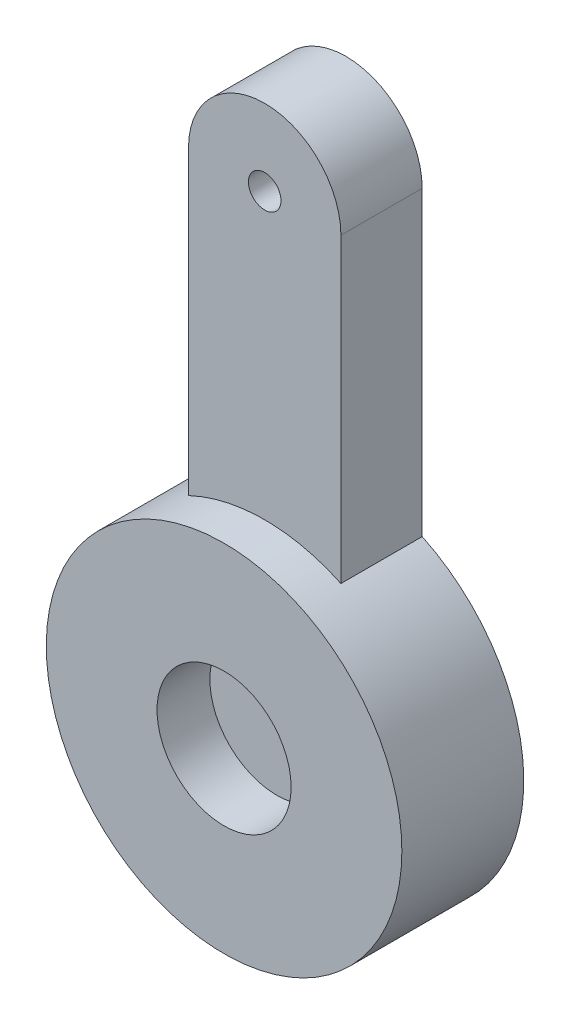
ISO-10303-21;
HEADER;
FILE_DESCRIPTION(('STEP AP214'),'2;1');
FILE_NAME('part.step','',(''),(''),'','','');
FILE_SCHEMA(('AUTOMOTIVE_DESIGN { 1 0 10303 214 1 1 1 1 }'));
ENDSEC;
DATA;
#1=APPLICATION_CONTEXT('core data for automotive mechanical design processes');
#2=APPLICATION_PROTOCOL_DEFINITION('international standard','automotive_design',2000,#1);
#3=PRODUCT_CONTEXT('',#1,'mechanical');
#4=PRODUCT('Part','Part','',(#3));
#5=PRODUCT_RELATED_PRODUCT_CATEGORY('part','',(#4));
#6=PRODUCT_DEFINITION_FORMATION('','',#4);
#7=PRODUCT_DEFINITION_CONTEXT('part definition',#1,'design');
#8=PRODUCT_DEFINITION('design','',#6,#7);
#9=PRODUCT_DEFINITION_SHAPE('','',#8);
#10=(LENGTH_UNIT() NAMED_UNIT(*) SI_UNIT(.MILLI.,.METRE.));
#11=(NAMED_UNIT(*) PLANE_ANGLE_UNIT() SI_UNIT($,.RADIAN.));
#12=(NAMED_UNIT(*) SI_UNIT($,.STERADIAN.) SOLID_ANGLE_UNIT());
#13=UNCERTAINTY_MEASURE_WITH_UNIT(LENGTH_MEASURE(1.E-05),#10,'distance_accuracy_value','');
#14=(GEOMETRIC_REPRESENTATION_CONTEXT(3) GLOBAL_UNCERTAINTY_ASSIGNED_CONTEXT((#13)) GLOBAL_UNIT_ASSIGNED_CONTEXT((#10,
#11,#12)) REPRESENTATION_CONTEXT('',''));
#15=CARTESIAN_POINT('',(0.,0.,0.));
#16=DIRECTION('',(0.,0.,1.));
#17=DIRECTION('',(1.,0.,0.));
#18=AXIS2_PLACEMENT_3D('',#15,#16,#17);
#19=CARTESIAN_POINT('',(3.05311331771918E-13,45.5,8.));
#20=DIRECTION('',(0.,0.,1.));
#21=DIRECTION('',(1.,0.,0.));
#22=AXIS2_PLACEMENT_3D('',#19,#20,#21);
#23=CYLINDRICAL_SURFACE('',#22,7.5);
#24=DIRECTION('',(0.,0.,-1.));
#25=VECTOR('',#24,1.);
#26=CARTESIAN_POINT('',(-7.4999999999997,45.5,8.));
#27=LINE('',#26,#25);
#28=CARTESIAN_POINT('',(-7.4999999999997,45.5,8.));
#29=VERTEX_POINT('',#28);
#30=CARTESIAN_POINT('',(-7.49999999999999,45.5,0.));
#31=VERTEX_POINT('',#30);
#32=EDGE_CURVE('E88',#29,#31,#27,.T.);
#33=ORIENTED_EDGE('',*,*,#32,.F.);
#34=CARTESIAN_POINT('',(3.05311331771918E-13,45.5,8.));
#35=DIRECTION('',(0.,0.,-1.));
#36=DIRECTION('',(-1.,0.,0.));
#37=AXIS2_PLACEMENT_3D('',#34,#35,#36);
#38=CIRCLE('',#37,7.5);
#39=CARTESIAN_POINT('',(7.50000000000001,45.5,8.));
#40=VERTEX_POINT('',#39);
#41=EDGE_CURVE('E63',#40,#29,#38,.F.);
#42=ORIENTED_EDGE('',*,*,#41,.F.);
#43=DIRECTION('',(0.,0.,-1.));
#44=VECTOR('',#43,1.);
#45=CARTESIAN_POINT('',(7.50000000000001,45.5,8.));
#46=LINE('',#45,#44);
#47=CARTESIAN_POINT('',(7.49999999999999,45.4999999999997,0.));
#48=VERTEX_POINT('',#47);
#49=EDGE_CURVE('E115',#48,#40,#46,.F.);
#50=ORIENTED_EDGE('',*,*,#49,.F.);
#51=CARTESIAN_POINT('',(0.,45.5,0.));
#52=DIRECTION('',(0.,0.,1.));
#53=DIRECTION('',(1.,0.,0.));
#54=AXIS2_PLACEMENT_3D('',#51,#52,#53);
#55=CIRCLE('',#54,7.5);
#56=EDGE_CURVE('E50',#31,#48,#55,.F.);
#57=ORIENTED_EDGE('',*,*,#56,.F.);
#58=EDGE_LOOP('',(#33,#42,#50,#57));
#59=FACE_BOUND('',#58,.T.);
#60=ADVANCED_FACE('F42',(#59),#23,.T.);
#61=CARTESIAN_POINT('',(0.,0.,12.));
#62=DIRECTION('',(0.,0.,-1.));
#63=DIRECTION('',(-1.,0.,0.));
#64=AXIS2_PLACEMENT_3D('',#61,#62,#63);
#65=CYLINDRICAL_SURFACE('',#64,17.5);
#66=CARTESIAN_POINT('',(0.,0.,12.));
#67=DIRECTION('',(0.,0.,1.));
#68=DIRECTION('',(1.,0.,0.));
#69=AXIS2_PLACEMENT_3D('',#66,#67,#68);
#70=CIRCLE('',#69,17.5);
#71=CARTESIAN_POINT('',(17.5,0.,12.));
#72=VERTEX_POINT('',#71);
#73=EDGE_CURVE('E99',#72,#72,#70,.T.);
#74=ORIENTED_EDGE('',*,*,#73,.F.);
#75=EDGE_LOOP('',(#74));
#76=FACE_BOUND('',#75,.T.);
#77=DIRECTION('',(0.,0.,-1.));
#78=VECTOR('',#77,1.);
#79=CARTESIAN_POINT('',(-7.5000000000003,15.8113883008416,12.));
#80=LINE('',#79,#78);
#81=CARTESIAN_POINT('',(-7.5000000000003,15.8113883008416,0.));
#82=VERTEX_POINT('',#81);
#83=CARTESIAN_POINT('',(-7.50000000000001,15.8113883008416,8.));
#84=VERTEX_POINT('',#83);
#85=EDGE_CURVE('E87',#82,#84,#80,.F.);
#86=ORIENTED_EDGE('',*,*,#85,.F.);
#87=CARTESIAN_POINT('',(0.,0.,0.));
#88=DIRECTION('',(0.,0.,1.));
#89=DIRECTION('',(1.,0.,0.));
#90=AXIS2_PLACEMENT_3D('',#87,#88,#89);
#91=CIRCLE('',#90,17.5);
#92=CARTESIAN_POINT('',(7.49999999999999,15.8113883008419,0.));
#93=VERTEX_POINT('',#92);
#94=EDGE_CURVE('E93',#82,#93,#91,.T.);
#95=ORIENTED_EDGE('',*,*,#94,.T.);
#96=DIRECTION('',(0.,0.,-1.));
#97=VECTOR('',#96,1.);
#98=CARTESIAN_POINT('',(7.50000000000001,15.8113883008419,12.));
#99=LINE('',#98,#97);
#100=CARTESIAN_POINT('',(7.50000000000001,15.8113883008419,8.));
#101=VERTEX_POINT('',#100);
#102=EDGE_CURVE('E105',#101,#93,#99,.T.);
#103=ORIENTED_EDGE('',*,*,#102,.F.);
#104=CARTESIAN_POINT('',(0.,0.,8.));
#105=DIRECTION('',(0.,0.,-1.));
#106=DIRECTION('',(-1.,0.,0.));
#107=AXIS2_PLACEMENT_3D('',#104,#105,#106);
#108=CIRCLE('',#107,17.5);
#109=EDGE_CURVE('E104',#84,#101,#108,.T.);
#110=ORIENTED_EDGE('',*,*,#109,.F.);
#111=EDGE_LOOP('',(#86,#95,#103,#110));
#112=FACE_BOUND('',#111,.T.);
#113=ADVANCED_FACE('F102',(#76,#112),#65,.T.);
#114=CARTESIAN_POINT('',(0.,0.,12.));
#115=DIRECTION('',(0.,0.,1.));
#116=DIRECTION('',(1.,0.,0.));
#117=AXIS2_PLACEMENT_3D('',#114,#115,#116);
#118=PLANE('',#117);
#119=CARTESIAN_POINT('',(0.,0.,12.));
#120=DIRECTION('',(0.,0.,1.));
#121=DIRECTION('',(1.,0.,0.));
#122=AXIS2_PLACEMENT_3D('',#119,#120,#121);
#123=CIRCLE('',#122,6.6);
#124=CARTESIAN_POINT('',(6.6,0.,12.));
#125=VERTEX_POINT('',#124);
#126=EDGE_CURVE('E124',#125,#125,#123,.T.);
#127=ORIENTED_EDGE('',*,*,#126,.F.);
#128=EDGE_LOOP('',(#127));
#129=FACE_BOUND('',#128,.T.);
#130=ORIENTED_EDGE('',*,*,#73,.T.);
#131=EDGE_LOOP('',(#130));
#132=FACE_BOUND('',#131,.T.);
#133=ADVANCED_FACE('F163',(#129,#132),#118,.T.);
#134=CARTESIAN_POINT('',(0.,0.,0.));
#135=DIRECTION('',(0.,0.,1.));
#136=DIRECTION('',(1.,0.,0.));
#137=AXIS2_PLACEMENT_3D('',#134,#135,#136);
#138=PLANE('',#137);
#139=CARTESIAN_POINT('',(0.,45.5,0.));
#140=DIRECTION('',(0.,0.,1.));
#141=DIRECTION('',(1.,0.,0.));
#142=AXIS2_PLACEMENT_3D('',#139,#140,#141);
#143=CIRCLE('',#142,5.);
#144=CARTESIAN_POINT('',(5.,45.5,0.));
#145=VERTEX_POINT('',#144);
#146=EDGE_CURVE('E11',#145,#145,#143,.F.);
#147=ORIENTED_EDGE('',*,*,#146,.F.);
#148=EDGE_LOOP('',(#147));
#149=FACE_BOUND('',#148,.T.);
#150=CARTESIAN_POINT('',(0.,0.,0.));
#151=DIRECTION('',(0.,0.,-1.));
#152=DIRECTION('',(-1.,0.,0.));
#153=AXIS2_PLACEMENT_3D('',#150,#151,#152);
#154=CIRCLE('',#153,6.6);
#155=CARTESIAN_POINT('',(-6.6,0.,0.));
#156=VERTEX_POINT('',#155);
#157=EDGE_CURVE('E130',#156,#156,#154,.T.);
#158=ORIENTED_EDGE('',*,*,#157,.F.);
#159=EDGE_LOOP('',(#158));
#160=FACE_BOUND('',#159,.T.);
#161=DIRECTION('',(0.,-1.,0.));
#162=VECTOR('',#161,1.);
#163=CARTESIAN_POINT('',(-7.49999999999999,38.,0.));
#164=LINE('',#163,#162);
#165=EDGE_CURVE('E82',#31,#82,#164,.T.);
#166=ORIENTED_EDGE('',*,*,#165,.F.);
#167=ORIENTED_EDGE('',*,*,#56,.T.);
#168=DIRECTION('',(0.,-1.,0.));
#169=VECTOR('',#168,1.);
#170=CARTESIAN_POINT('',(7.49999999999999,37.9999999999997,0.));
#171=LINE('',#170,#169);
#172=EDGE_CURVE('E89',#48,#93,#171,.T.);
#173=ORIENTED_EDGE('',*,*,#172,.T.);
#174=ORIENTED_EDGE('',*,*,#94,.F.);
#175=EDGE_LOOP('',(#166,#167,#173,#174));
#176=FACE_BOUND('',#175,.T.);
#177=ADVANCED_FACE('F94',(#149,#160,#176),#138,.F.);
#178=CARTESIAN_POINT('',(-7.49999999999999,38.,0.));
#179=DIRECTION('',(1.,0.,0.));
#180=DIRECTION('',(0.,0.,-1.));
#181=AXIS2_PLACEMENT_3D('',#178,#179,#180);
#182=PLANE('',#181);
#183=DIRECTION('',(0.,-1.,0.));
#184=VECTOR('',#183,1.);
#185=CARTESIAN_POINT('',(-7.4999999999997,38.,8.));
#186=LINE('',#185,#184);
#187=EDGE_CURVE('E107',#29,#84,#186,.T.);
#188=ORIENTED_EDGE('',*,*,#187,.F.);
#189=ORIENTED_EDGE('',*,*,#32,.T.);
#190=ORIENTED_EDGE('',*,*,#165,.T.);
#191=ORIENTED_EDGE('',*,*,#85,.T.);
#192=EDGE_LOOP('',(#188,#189,#190,#191));
#193=FACE_BOUND('',#192,.T.);
#194=ADVANCED_FACE('F85',(#193),#182,.F.);
#195=CARTESIAN_POINT('',(7.49999999999999,37.9999999999997,0.));
#196=DIRECTION('',(-1.,0.,0.));
#197=DIRECTION('',(0.,0.,1.));
#198=AXIS2_PLACEMENT_3D('',#195,#196,#197);
#199=PLANE('',#198);
#200=ORIENTED_EDGE('',*,*,#172,.F.);
#201=ORIENTED_EDGE('',*,*,#49,.T.);
#202=DIRECTION('',(0.,-1.,0.));
#203=VECTOR('',#202,1.);
#204=CARTESIAN_POINT('',(7.50000000000001,38.,8.));
#205=LINE('',#204,#203);
#206=EDGE_CURVE('E120',#40,#101,#205,.T.);
#207=ORIENTED_EDGE('',*,*,#206,.T.);
#208=ORIENTED_EDGE('',*,*,#102,.T.);
#209=EDGE_LOOP('',(#200,#201,#207,#208));
#210=FACE_BOUND('',#209,.T.);
#211=ADVANCED_FACE('F196',(#210),#199,.F.);
#212=CARTESIAN_POINT('',(-7.4999999999997,38.,8.));
#213=DIRECTION('',(0.,0.,-1.));
#214=DIRECTION('',(-1.,0.,0.));
#215=AXIS2_PLACEMENT_3D('',#212,#213,#214);
#216=PLANE('',#215);
#217=CARTESIAN_POINT('',(3.05311331771918E-13,45.5,8.));
#218=DIRECTION('',(0.,0.,-1.));
#219=DIRECTION('',(-1.,0.,0.));
#220=AXIS2_PLACEMENT_3D('',#217,#218,#219);
#221=CIRCLE('',#220,1.6);
#222=CARTESIAN_POINT('',(-1.59999999999969,45.5,8.));
#223=VERTEX_POINT('',#222);
#224=EDGE_CURVE('E138',#223,#223,#221,.T.);
#225=ORIENTED_EDGE('',*,*,#224,.T.);
#226=EDGE_LOOP('',(#225));
#227=FACE_BOUND('',#226,.T.);
#228=ORIENTED_EDGE('',*,*,#206,.F.);
#229=ORIENTED_EDGE('',*,*,#41,.T.);
#230=ORIENTED_EDGE('',*,*,#187,.T.);
#231=ORIENTED_EDGE('',*,*,#109,.T.);
#232=EDGE_LOOP('',(#228,#229,#230,#231));
#233=FACE_BOUND('',#232,.T.);
#234=ADVANCED_FACE('F119',(#227,#233),#216,.F.);
#235=CARTESIAN_POINT('',(0.,1.52655665885959E-13,6.8));
#236=DIRECTION('',(0.,0.,1.));
#237=DIRECTION('',(1.,0.,0.));
#238=AXIS2_PLACEMENT_3D('',#235,#236,#237);
#239=CYLINDRICAL_SURFACE('',#238,6.6);
#240=CARTESIAN_POINT('',(0.,1.52655665885959E-13,6.8));
#241=DIRECTION('',(0.,0.,1.));
#242=DIRECTION('',(1.,0.,0.));
#243=AXIS2_PLACEMENT_3D('',#240,#241,#242);
#244=CIRCLE('',#243,6.6);
#245=CARTESIAN_POINT('',(6.6,1.52655665885959E-13,6.8));
#246=VERTEX_POINT('',#245);
#247=EDGE_CURVE('E90',#246,#246,#244,.T.);
#248=ORIENTED_EDGE('',*,*,#247,.F.);
#249=EDGE_LOOP('',(#248));
#250=FACE_BOUND('',#249,.T.);
#251=ORIENTED_EDGE('',*,*,#126,.T.);
#252=EDGE_LOOP('',(#251));
#253=FACE_BOUND('',#252,.T.);
#254=ADVANCED_FACE('F178',(#250,#253),#239,.F.);
#255=CARTESIAN_POINT('',(0.,1.52655665885959E-13,6.8));
#256=DIRECTION('',(0.,0.,1.));
#257=DIRECTION('',(1.,0.,0.));
#258=AXIS2_PLACEMENT_3D('',#255,#256,#257);
#259=PLANE('',#258);
#260=ORIENTED_EDGE('',*,*,#247,.T.);
#261=EDGE_LOOP('',(#260));
#262=FACE_BOUND('',#261,.T.);
#263=ADVANCED_FACE('F169',(#262),#259,.T.);
#264=CARTESIAN_POINT('',(0.,0.,5.2));
#265=DIRECTION('',(0.,0.,-1.));
#266=DIRECTION('',(-1.,0.,0.));
#267=AXIS2_PLACEMENT_3D('',#264,#265,#266);
#268=CYLINDRICAL_SURFACE('',#267,6.6);
#269=CARTESIAN_POINT('',(0.,0.,5.2));
#270=DIRECTION('',(0.,0.,-1.));
#271=DIRECTION('',(-1.,0.,0.));
#272=AXIS2_PLACEMENT_3D('',#269,#270,#271);
#273=CIRCLE('',#272,6.6);
#274=CARTESIAN_POINT('',(-6.6,0.,5.2));
#275=VERTEX_POINT('',#274);
#276=EDGE_CURVE('E127',#275,#275,#273,.T.);
#277=ORIENTED_EDGE('',*,*,#276,.F.);
#278=EDGE_LOOP('',(#277));
#279=FACE_BOUND('',#278,.T.);
#280=ORIENTED_EDGE('',*,*,#157,.T.);
#281=EDGE_LOOP('',(#280));
#282=FACE_BOUND('',#281,.T.);
#283=ADVANCED_FACE('F167',(#279,#282),#268,.F.);
#284=CARTESIAN_POINT('',(0.,0.,5.2));
#285=DIRECTION('',(0.,0.,-1.));
#286=DIRECTION('',(-1.,0.,0.));
#287=AXIS2_PLACEMENT_3D('',#284,#285,#286);
#288=PLANE('',#287);
#289=ORIENTED_EDGE('',*,*,#276,.T.);
#290=EDGE_LOOP('',(#289));
#291=FACE_BOUND('',#290,.T.);
#292=ADVANCED_FACE('F157',(#291),#288,.T.);
#293=CARTESIAN_POINT('',(3.05311331771918E-13,45.5,-1.5));
#294=DIRECTION('',(0.,0.,1.));
#295=DIRECTION('',(1.,0.,0.));
#296=AXIS2_PLACEMENT_3D('',#293,#294,#295);
#297=CYLINDRICAL_SURFACE('',#296,5.);
#298=CARTESIAN_POINT('',(3.05311331771918E-13,45.5,-1.5));
#299=DIRECTION('',(0.,0.,-1.));
#300=DIRECTION('',(-1.,0.,0.));
#301=AXIS2_PLACEMENT_3D('',#298,#299,#300);
#302=CIRCLE('',#301,5.);
#303=CARTESIAN_POINT('',(-4.99999999999969,45.5,-1.5));
#304=VERTEX_POINT('',#303);
#305=EDGE_CURVE('E133',#304,#304,#302,.T.);
#306=ORIENTED_EDGE('',*,*,#305,.F.);
#307=EDGE_LOOP('',(#306));
#308=FACE_BOUND('',#307,.T.);
#309=ORIENTED_EDGE('',*,*,#146,.T.);
#310=EDGE_LOOP('',(#309));
#311=FACE_BOUND('',#310,.T.);
#312=ADVANCED_FACE('F151',(#308,#311),#297,.T.);
#313=CARTESIAN_POINT('',(3.05311331771918E-13,45.5,-1.5));
#314=DIRECTION('',(0.,0.,-1.));
#315=DIRECTION('',(-1.,0.,0.));
#316=AXIS2_PLACEMENT_3D('',#313,#314,#315);
#317=PLANE('',#316);
#318=CARTESIAN_POINT('',(3.05311331771918E-13,45.5,-1.5));
#319=DIRECTION('',(0.,0.,-1.));
#320=DIRECTION('',(-1.,0.,0.));
#321=AXIS2_PLACEMENT_3D('',#318,#319,#320);
#322=CIRCLE('',#321,1.6);
#323=CARTESIAN_POINT('',(-1.59999999999969,45.5,-1.5));
#324=VERTEX_POINT('',#323);
#325=EDGE_CURVE('E141',#324,#324,#322,.T.);
#326=ORIENTED_EDGE('',*,*,#325,.F.);
#327=EDGE_LOOP('',(#326));
#328=FACE_BOUND('',#327,.T.);
#329=ORIENTED_EDGE('',*,*,#305,.T.);
#330=EDGE_LOOP('',(#329));
#331=FACE_BOUND('',#330,.T.);
#332=ADVANCED_FACE('F148',(#328,#331),#317,.T.);
#333=CARTESIAN_POINT('',(0.,45.5,12.));
#334=DIRECTION('',(0.,0.,-1.));
#335=DIRECTION('',(-1.,0.,0.));
#336=AXIS2_PLACEMENT_3D('',#333,#334,#335);
#337=CYLINDRICAL_SURFACE('',#336,1.6);
#338=ORIENTED_EDGE('',*,*,#325,.T.);
#339=EDGE_LOOP('',(#338));
#340=FACE_BOUND('',#339,.T.);
#341=ORIENTED_EDGE('',*,*,#224,.F.);
#342=EDGE_LOOP('',(#341));
#343=FACE_BOUND('',#342,.T.);
#344=ADVANCED_FACE('F145',(#340,#343),#337,.F.);
#345=CLOSED_SHELL('',(#60,#113,#133,#177,#194,#211,#234,#254,#263,#283,#292,#312,#332,#344));
#346=MANIFOLD_SOLID_BREP('B2',#345);
#347=ADVANCED_BREP_SHAPE_REPRESENTATION('',(#18,#346),#14);
#348=SHAPE_DEFINITION_REPRESENTATION(#9,#347);
ENDSEC;
END-ISO-10303-21;
